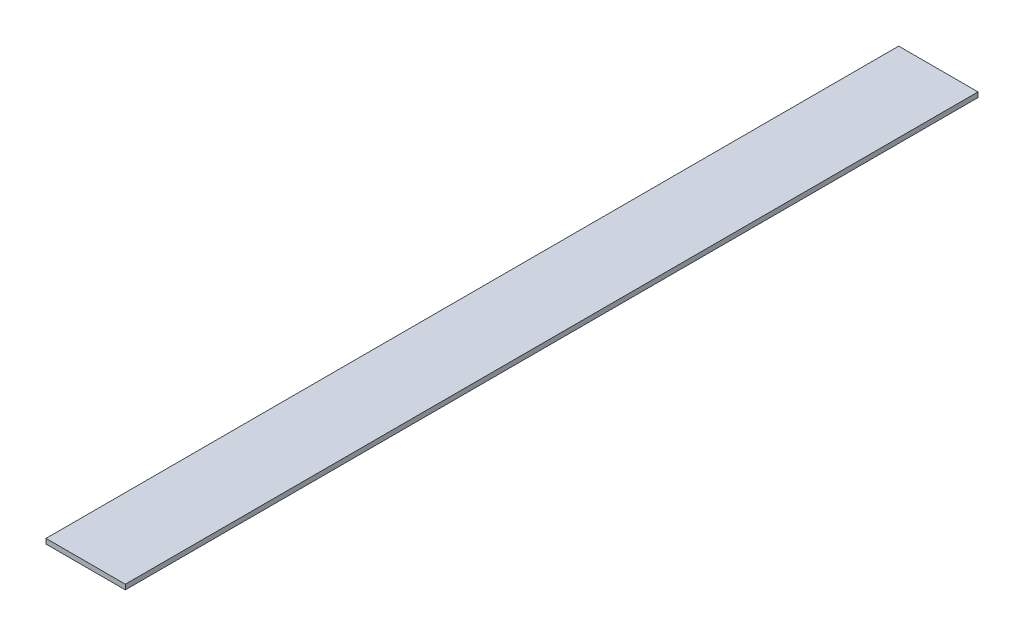
ISO-10303-21;
HEADER;
FILE_DESCRIPTION(('STEP AP214'),'2;1');
FILE_NAME('part.step','',(''),(''),'','','');
FILE_SCHEMA(('AUTOMOTIVE_DESIGN { 1 0 10303 214 1 1 1 1 }'));
ENDSEC;
DATA;
#1=APPLICATION_CONTEXT('core data for automotive mechanical design processes');
#2=APPLICATION_PROTOCOL_DEFINITION('international standard','automotive_design',2000,#1);
#3=PRODUCT_CONTEXT('',#1,'mechanical');
#4=PRODUCT('Part','Part','',(#3));
#5=PRODUCT_RELATED_PRODUCT_CATEGORY('part','',(#4));
#6=PRODUCT_DEFINITION_FORMATION('','',#4);
#7=PRODUCT_DEFINITION_CONTEXT('part definition',#1,'design');
#8=PRODUCT_DEFINITION('design','',#6,#7);
#9=PRODUCT_DEFINITION_SHAPE('','',#8);
#10=(LENGTH_UNIT() NAMED_UNIT(*) SI_UNIT(.MILLI.,.METRE.));
#11=(NAMED_UNIT(*) PLANE_ANGLE_UNIT() SI_UNIT($,.RADIAN.));
#12=(NAMED_UNIT(*) SI_UNIT($,.STERADIAN.) SOLID_ANGLE_UNIT());
#13=UNCERTAINTY_MEASURE_WITH_UNIT(LENGTH_MEASURE(1.E-05),#10,'distance_accuracy_value','');
#14=(GEOMETRIC_REPRESENTATION_CONTEXT(3) GLOBAL_UNCERTAINTY_ASSIGNED_CONTEXT((#13)) GLOBAL_UNIT_ASSIGNED_CONTEXT((#10,
#11,#12)) REPRESENTATION_CONTEXT('',''));
#15=CARTESIAN_POINT('',(0.,0.,0.));
#16=DIRECTION('',(0.,0.,1.));
#17=DIRECTION('',(1.,0.,0.));
#18=AXIS2_PLACEMENT_3D('',#15,#16,#17);
#19=CARTESIAN_POINT('',(0.,3.175,0.));
#20=DIRECTION('',(1.,0.,0.));
#21=DIRECTION('',(0.,0.,-1.));
#22=AXIS2_PLACEMENT_3D('',#19,#20,#21);
#23=PLANE('',#22);
#24=DIRECTION('',(0.,0.,1.));
#25=VECTOR('',#24,1.);
#26=CARTESIAN_POINT('',(0.,0.,0.));
#27=LINE('',#26,#25);
#28=CARTESIAN_POINT('',(0.,0.,-546.1));
#29=VERTEX_POINT('',#28);
#30=CARTESIAN_POINT('',(0.,0.,0.));
#31=VERTEX_POINT('',#30);
#32=EDGE_CURVE('E105',#29,#31,#27,.T.);
#33=ORIENTED_EDGE('',*,*,#32,.T.);
#34=DIRECTION('',(0.,-1.,0.));
#35=VECTOR('',#34,1.);
#36=CARTESIAN_POINT('',(0.,3.175,0.));
#37=LINE('',#36,#35);
#38=CARTESIAN_POINT('',(0.,3.175,0.));
#39=VERTEX_POINT('',#38);
#40=EDGE_CURVE('E11',#39,#31,#37,.T.);
#41=ORIENTED_EDGE('',*,*,#40,.F.);
#42=DIRECTION('',(0.,0.,1.));
#43=VECTOR('',#42,1.);
#44=CARTESIAN_POINT('',(0.,3.175,0.));
#45=LINE('',#44,#43);
#46=CARTESIAN_POINT('',(0.,3.175,-546.1));
#47=VERTEX_POINT('',#46);
#48=EDGE_CURVE('E88',#47,#39,#45,.T.);
#49=ORIENTED_EDGE('',*,*,#48,.F.);
#50=DIRECTION('',(0.,-1.,0.));
#51=VECTOR('',#50,1.);
#52=CARTESIAN_POINT('',(0.,3.175,-546.1));
#53=LINE('',#52,#51);
#54=EDGE_CURVE('E101',#47,#29,#53,.T.);
#55=ORIENTED_EDGE('',*,*,#54,.T.);
#56=EDGE_LOOP('',(#33,#41,#49,#55));
#57=FACE_BOUND('',#56,.T.);
#58=ADVANCED_FACE('F36',(#57),#23,.F.);
#59=CARTESIAN_POINT('',(0.,3.175,0.));
#60=DIRECTION('',(0.,0.,-1.));
#61=DIRECTION('',(-1.,0.,0.));
#62=AXIS2_PLACEMENT_3D('',#59,#60,#61);
#63=PLANE('',#62);
#64=DIRECTION('',(1.,0.,0.));
#65=VECTOR('',#64,1.);
#66=CARTESIAN_POINT('',(0.,0.,0.));
#67=LINE('',#66,#65);
#68=CARTESIAN_POINT('',(50.8,0.,0.));
#69=VERTEX_POINT('',#68);
#70=EDGE_CURVE('E93',#31,#69,#67,.T.);
#71=ORIENTED_EDGE('',*,*,#70,.T.);
#72=DIRECTION('',(0.,-1.,0.));
#73=VECTOR('',#72,1.);
#74=CARTESIAN_POINT('',(50.8,3.175,0.));
#75=LINE('',#74,#73);
#76=CARTESIAN_POINT('',(50.8,3.175,0.));
#77=VERTEX_POINT('',#76);
#78=EDGE_CURVE('E45',#77,#69,#75,.T.);
#79=ORIENTED_EDGE('',*,*,#78,.F.);
#80=DIRECTION('',(1.,0.,0.));
#81=VECTOR('',#80,1.);
#82=CARTESIAN_POINT('',(0.,3.175,0.));
#83=LINE('',#82,#81);
#84=EDGE_CURVE('E83',#39,#77,#83,.T.);
#85=ORIENTED_EDGE('',*,*,#84,.F.);
#86=ORIENTED_EDGE('',*,*,#40,.T.);
#87=EDGE_LOOP('',(#71,#79,#85,#86));
#88=FACE_BOUND('',#87,.T.);
#89=ADVANCED_FACE('F92',(#88),#63,.F.);
#90=CARTESIAN_POINT('',(50.8,3.175,0.));
#91=DIRECTION('',(-1.,0.,0.));
#92=DIRECTION('',(0.,0.,1.));
#93=AXIS2_PLACEMENT_3D('',#90,#91,#92);
#94=PLANE('',#93);
#95=DIRECTION('',(0.,0.,-1.));
#96=VECTOR('',#95,1.);
#97=CARTESIAN_POINT('',(50.8,0.,0.));
#98=LINE('',#97,#96);
#99=CARTESIAN_POINT('',(50.8,0.,-546.1));
#100=VERTEX_POINT('',#99);
#101=EDGE_CURVE('E70',#69,#100,#98,.T.);
#102=ORIENTED_EDGE('',*,*,#101,.T.);
#103=DIRECTION('',(0.,-1.,0.));
#104=VECTOR('',#103,1.);
#105=CARTESIAN_POINT('',(50.8,3.175,-546.1));
#106=LINE('',#105,#104);
#107=CARTESIAN_POINT('',(50.8,3.175,-546.1));
#108=VERTEX_POINT('',#107);
#109=EDGE_CURVE('E95',#108,#100,#106,.T.);
#110=ORIENTED_EDGE('',*,*,#109,.F.);
#111=DIRECTION('',(0.,0.,-1.));
#112=VECTOR('',#111,1.);
#113=CARTESIAN_POINT('',(50.8,3.175,0.));
#114=LINE('',#113,#112);
#115=EDGE_CURVE('E86',#77,#108,#114,.T.);
#116=ORIENTED_EDGE('',*,*,#115,.F.);
#117=ORIENTED_EDGE('',*,*,#78,.T.);
#118=EDGE_LOOP('',(#102,#110,#116,#117));
#119=FACE_BOUND('',#118,.T.);
#120=ADVANCED_FACE('F96',(#119),#94,.F.);
#121=CARTESIAN_POINT('',(0.,3.175,-546.1));
#122=DIRECTION('',(0.,0.,1.));
#123=DIRECTION('',(1.,0.,0.));
#124=AXIS2_PLACEMENT_3D('',#121,#122,#123);
#125=PLANE('',#124);
#126=DIRECTION('',(-1.,0.,0.));
#127=VECTOR('',#126,1.);
#128=CARTESIAN_POINT('',(0.,0.,-546.1));
#129=LINE('',#128,#127);
#130=EDGE_CURVE('E76',#100,#29,#129,.T.);
#131=ORIENTED_EDGE('',*,*,#130,.T.);
#132=ORIENTED_EDGE('',*,*,#54,.F.);
#133=DIRECTION('',(-1.,0.,0.));
#134=VECTOR('',#133,1.);
#135=CARTESIAN_POINT('',(0.,3.175,-546.1));
#136=LINE('',#135,#134);
#137=EDGE_CURVE('E53',#108,#47,#136,.T.);
#138=ORIENTED_EDGE('',*,*,#137,.F.);
#139=ORIENTED_EDGE('',*,*,#109,.T.);
#140=EDGE_LOOP('',(#131,#132,#138,#139));
#141=FACE_BOUND('',#140,.T.);
#142=ADVANCED_FACE('F117',(#141),#125,.F.);
#143=CARTESIAN_POINT('',(0.,3.175,0.));
#144=DIRECTION('',(0.,-1.,0.));
#145=DIRECTION('',(0.,0.,-1.));
#146=AXIS2_PLACEMENT_3D('',#143,#144,#145);
#147=PLANE('',#146);
#148=ORIENTED_EDGE('',*,*,#48,.T.);
#149=ORIENTED_EDGE('',*,*,#84,.T.);
#150=ORIENTED_EDGE('',*,*,#115,.T.);
#151=ORIENTED_EDGE('',*,*,#137,.T.);
#152=EDGE_LOOP('',(#148,#149,#150,#151));
#153=FACE_BOUND('',#152,.T.);
#154=ADVANCED_FACE('F84',(#153),#147,.F.);
#155=CARTESIAN_POINT('',(0.,0.,0.));
#156=DIRECTION('',(0.,-1.,0.));
#157=DIRECTION('',(0.,0.,-1.));
#158=AXIS2_PLACEMENT_3D('',#155,#156,#157);
#159=PLANE('',#158);
#160=ORIENTED_EDGE('',*,*,#32,.F.);
#161=ORIENTED_EDGE('',*,*,#130,.F.);
#162=ORIENTED_EDGE('',*,*,#101,.F.);
#163=ORIENTED_EDGE('',*,*,#70,.F.);
#164=EDGE_LOOP('',(#160,#161,#162,#163));
#165=FACE_BOUND('',#164,.T.);
#166=ADVANCED_FACE('F120',(#165),#159,.T.);
#167=CLOSED_SHELL('',(#58,#89,#120,#142,#154,#166));
#168=MANIFOLD_SOLID_BREP('B2',#167);
#169=ADVANCED_BREP_SHAPE_REPRESENTATION('',(#18,#168),#14);
#170=SHAPE_DEFINITION_REPRESENTATION(#9,#169);
ENDSEC;
END-ISO-10303-21;
